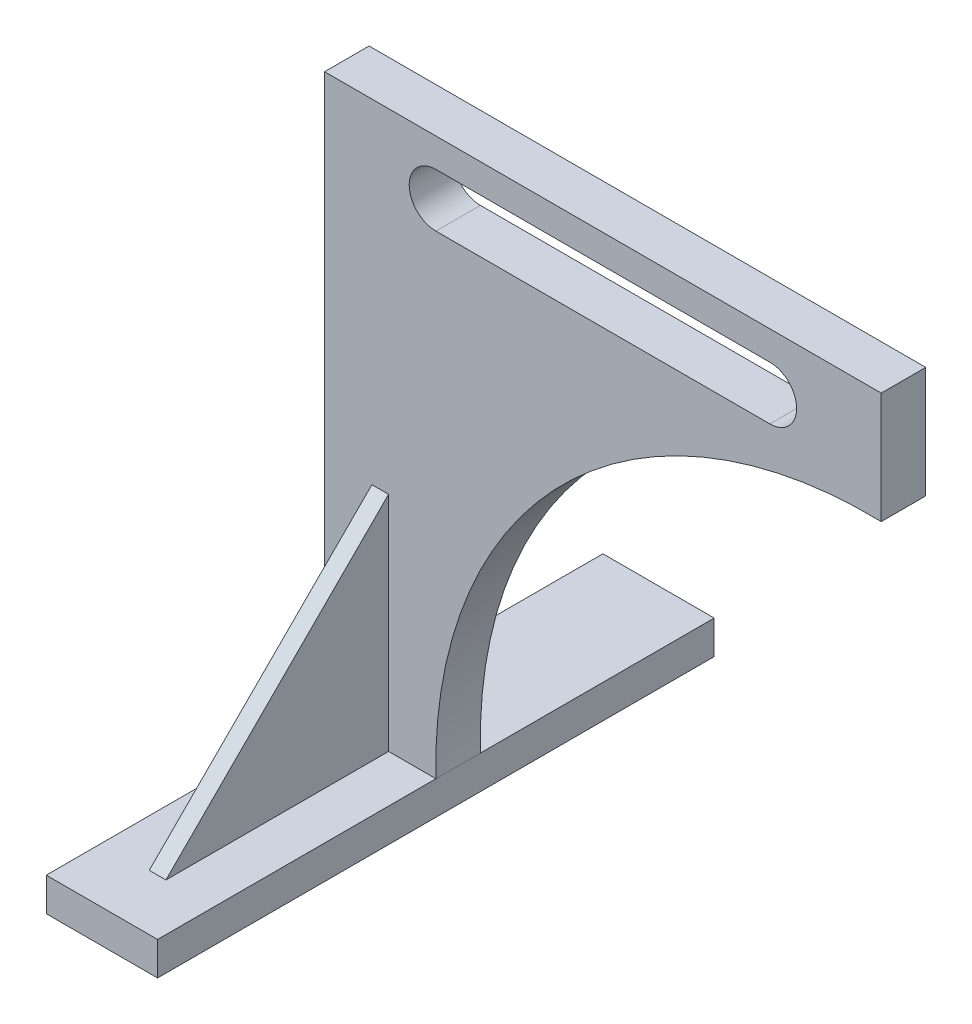
ISO-10303-21;
HEADER;
FILE_DESCRIPTION(('STEP AP214'),'2;1');
FILE_NAME('part.step','',(''),(''),'','','');
FILE_SCHEMA(('AUTOMOTIVE_DESIGN { 1 0 10303 214 1 1 1 1 }'));
ENDSEC;
DATA;
#1=APPLICATION_CONTEXT('core data for automotive mechanical design processes');
#2=APPLICATION_PROTOCOL_DEFINITION('international standard','automotive_design',2000,#1);
#3=PRODUCT_CONTEXT('',#1,'mechanical');
#4=PRODUCT('Part','Part','',(#3));
#5=PRODUCT_RELATED_PRODUCT_CATEGORY('part','',(#4));
#6=PRODUCT_DEFINITION_FORMATION('','',#4);
#7=PRODUCT_DEFINITION_CONTEXT('part definition',#1,'design');
#8=PRODUCT_DEFINITION('design','',#6,#7);
#9=PRODUCT_DEFINITION_SHAPE('','',#8);
#10=(LENGTH_UNIT() NAMED_UNIT(*) SI_UNIT(.MILLI.,.METRE.));
#11=(NAMED_UNIT(*) PLANE_ANGLE_UNIT() SI_UNIT($,.RADIAN.));
#12=(NAMED_UNIT(*) SI_UNIT($,.STERADIAN.) SOLID_ANGLE_UNIT());
#13=UNCERTAINTY_MEASURE_WITH_UNIT(LENGTH_MEASURE(1.E-05),#10,'distance_accuracy_value','');
#14=(GEOMETRIC_REPRESENTATION_CONTEXT(3) GLOBAL_UNCERTAINTY_ASSIGNED_CONTEXT((#13)) GLOBAL_UNIT_ASSIGNED_CONTEXT((#10,
#11,#12)) REPRESENTATION_CONTEXT('',''));
#15=CARTESIAN_POINT('',(0.,0.,0.));
#16=DIRECTION('',(0.,0.,1.));
#17=DIRECTION('',(1.,0.,0.));
#18=AXIS2_PLACEMENT_3D('',#15,#16,#17);
#19=CARTESIAN_POINT('',(-25.,7.5,-250.));
#20=DIRECTION('',(0.,1.,0.));
#21=DIRECTION('',(0.,0.,1.));
#22=AXIS2_PLACEMENT_3D('',#19,#20,#21);
#23=PLANE('',#22);
#24=DIRECTION('',(0.,0.,1.));
#25=VECTOR('',#24,1.);
#26=CARTESIAN_POINT('',(-25.,7.5,-250.));
#27=LINE('',#26,#25);
#28=CARTESIAN_POINT('',(-25.,7.5,-250.));
#29=VERTEX_POINT('',#28);
#30=CARTESIAN_POINT('',(-25.,7.5,-145.));
#31=VERTEX_POINT('',#30);
#32=EDGE_CURVE('E323',#29,#31,#27,.T.);
#33=ORIENTED_EDGE('',*,*,#32,.T.);
#34=DIRECTION('',(1.,0.,0.));
#35=VECTOR('',#34,1.);
#36=CARTESIAN_POINT('',(25.,7.5,-145.));
#37=LINE('',#36,#35);
#38=CARTESIAN_POINT('',(25.,7.5,-145.));
#39=VERTEX_POINT('',#38);
#40=EDGE_CURVE('E237',#31,#39,#37,.T.);
#41=ORIENTED_EDGE('',*,*,#40,.T.);
#42=DIRECTION('',(0.,0.,1.));
#43=VECTOR('',#42,1.);
#44=CARTESIAN_POINT('',(25.,7.5,-250.));
#45=LINE('',#44,#43);
#46=CARTESIAN_POINT('',(25.,7.5,-250.));
#47=VERTEX_POINT('',#46);
#48=EDGE_CURVE('E49',#47,#39,#45,.T.);
#49=ORIENTED_EDGE('',*,*,#48,.F.);
#50=DIRECTION('',(-1.,0.,0.));
#51=VECTOR('',#50,1.);
#52=CARTESIAN_POINT('',(-25.,7.5,-250.));
#53=LINE('',#52,#51);
#54=EDGE_CURVE('E294',#47,#29,#53,.T.);
#55=ORIENTED_EDGE('',*,*,#54,.T.);
#56=EDGE_LOOP('',(#33,#41,#49,#55));
#57=FACE_BOUND('',#56,.T.);
#58=ADVANCED_FACE('F45',(#57),#23,.T.);
#59=CARTESIAN_POINT('',(25.,7.5,-250.));
#60=DIRECTION('',(1.,0.,0.));
#61=DIRECTION('',(0.,1.,0.));
#62=AXIS2_PLACEMENT_3D('',#59,#60,#61);
#63=PLANE('',#62);
#64=DIRECTION('',(0.,1.,0.));
#65=VECTOR('',#64,1.);
#66=CARTESIAN_POINT('',(25.,7.5,0.));
#67=LINE('',#66,#65);
#68=CARTESIAN_POINT('',(25.,-7.5,0.));
#69=VERTEX_POINT('',#68);
#70=CARTESIAN_POINT('',(25.,7.5,0.));
#71=VERTEX_POINT('',#70);
#72=EDGE_CURVE('E280',#69,#71,#67,.T.);
#73=ORIENTED_EDGE('',*,*,#72,.F.);
#74=DIRECTION('',(0.,0.,1.));
#75=VECTOR('',#74,1.);
#76=CARTESIAN_POINT('',(25.,-7.5,-250.));
#77=LINE('',#76,#75);
#78=CARTESIAN_POINT('',(25.,-7.5,-250.));
#79=VERTEX_POINT('',#78);
#80=EDGE_CURVE('E11',#79,#69,#77,.T.);
#81=ORIENTED_EDGE('',*,*,#80,.F.);
#82=DIRECTION('',(0.,1.,0.));
#83=VECTOR('',#82,1.);
#84=CARTESIAN_POINT('',(25.,7.5,-250.));
#85=LINE('',#84,#83);
#86=EDGE_CURVE('E290',#79,#47,#85,.T.);
#87=ORIENTED_EDGE('',*,*,#86,.T.);
#88=ORIENTED_EDGE('',*,*,#48,.T.);
#89=DIRECTION('',(0.,0.,1.));
#90=VECTOR('',#89,1.);
#91=CARTESIAN_POINT('',(25.,7.50000000000005,-145.));
#92=LINE('',#91,#90);
#93=CARTESIAN_POINT('',(25.,7.50000000000005,-125.));
#94=VERTEX_POINT('',#93);
#95=EDGE_CURVE('E257',#39,#94,#92,.T.);
#96=ORIENTED_EDGE('',*,*,#95,.T.);
#97=EDGE_CURVE('E307',#94,#71,#45,.T.);
#98=ORIENTED_EDGE('',*,*,#97,.T.);
#99=EDGE_LOOP('',(#73,#81,#87,#88,#96,#98));
#100=FACE_BOUND('',#99,.T.);
#101=ADVANCED_FACE('F47',(#100),#63,.T.);
#102=CARTESIAN_POINT('',(-25.,-7.5,-250.));
#103=DIRECTION('',(0.,-1.,0.));
#104=DIRECTION('',(0.,0.,-1.));
#105=AXIS2_PLACEMENT_3D('',#102,#103,#104);
#106=PLANE('',#105);
#107=DIRECTION('',(1.,0.,0.));
#108=VECTOR('',#107,1.);
#109=CARTESIAN_POINT('',(-25.,-7.5,0.));
#110=LINE('',#109,#108);
#111=CARTESIAN_POINT('',(-25.,-7.5,0.));
#112=VERTEX_POINT('',#111);
#113=EDGE_CURVE('E295',#112,#69,#110,.T.);
#114=ORIENTED_EDGE('',*,*,#113,.F.);
#115=DIRECTION('',(0.,0.,1.));
#116=VECTOR('',#115,1.);
#117=CARTESIAN_POINT('',(-25.,-7.5,-250.));
#118=LINE('',#117,#116);
#119=CARTESIAN_POINT('',(-25.,-7.5,-250.));
#120=VERTEX_POINT('',#119);
#121=EDGE_CURVE('E55',#120,#112,#118,.T.);
#122=ORIENTED_EDGE('',*,*,#121,.F.);
#123=DIRECTION('',(1.,0.,0.));
#124=VECTOR('',#123,1.);
#125=CARTESIAN_POINT('',(-25.,-7.5,-250.));
#126=LINE('',#125,#124);
#127=EDGE_CURVE('E303',#120,#79,#126,.T.);
#128=ORIENTED_EDGE('',*,*,#127,.T.);
#129=ORIENTED_EDGE('',*,*,#80,.T.);
#130=EDGE_LOOP('',(#114,#122,#128,#129));
#131=FACE_BOUND('',#130,.T.);
#132=ADVANCED_FACE('F348',(#131),#106,.T.);
#133=CARTESIAN_POINT('',(-25.,7.5,-250.));
#134=DIRECTION('',(-1.,0.,0.));
#135=DIRECTION('',(0.,-1.,0.));
#136=AXIS2_PLACEMENT_3D('',#133,#134,#135);
#137=PLANE('',#136);
#138=DIRECTION('',(0.,-1.,0.));
#139=VECTOR('',#138,1.);
#140=CARTESIAN_POINT('',(-25.,7.5,0.));
#141=LINE('',#140,#139);
#142=CARTESIAN_POINT('',(-25.,7.5,0.));
#143=VERTEX_POINT('',#142);
#144=EDGE_CURVE('E315',#143,#112,#141,.T.);
#145=ORIENTED_EDGE('',*,*,#144,.F.);
#146=CARTESIAN_POINT('',(-25.,7.5,-125.));
#147=VERTEX_POINT('',#146);
#148=EDGE_CURVE('E325',#147,#143,#27,.T.);
#149=ORIENTED_EDGE('',*,*,#148,.F.);
#150=DIRECTION('',(0.,-1.,0.));
#151=VECTOR('',#150,1.);
#152=CARTESIAN_POINT('',(-25.,7.5,-125.));
#153=LINE('',#152,#151);
#154=CARTESIAN_POINT('',(-25.,257.5,-125.));
#155=VERTEX_POINT('',#154);
#156=EDGE_CURVE('E241',#155,#147,#153,.T.);
#157=ORIENTED_EDGE('',*,*,#156,.F.);
#158=DIRECTION('',(0.,0.,1.));
#159=VECTOR('',#158,1.);
#160=CARTESIAN_POINT('',(-25.,257.5,-145.));
#161=LINE('',#160,#159);
#162=CARTESIAN_POINT('',(-25.,257.5,-145.));
#163=VERTEX_POINT('',#162);
#164=EDGE_CURVE('E277',#163,#155,#161,.T.);
#165=ORIENTED_EDGE('',*,*,#164,.F.);
#166=DIRECTION('',(0.,-1.,0.));
#167=VECTOR('',#166,1.);
#168=CARTESIAN_POINT('',(-25.,7.5,-145.));
#169=LINE('',#168,#167);
#170=EDGE_CURVE('E253',#163,#31,#169,.T.);
#171=ORIENTED_EDGE('',*,*,#170,.T.);
#172=ORIENTED_EDGE('',*,*,#32,.F.);
#173=DIRECTION('',(0.,-1.,0.));
#174=VECTOR('',#173,1.);
#175=CARTESIAN_POINT('',(-25.,7.5,-250.));
#176=LINE('',#175,#174);
#177=EDGE_CURVE('E299',#29,#120,#176,.T.);
#178=ORIENTED_EDGE('',*,*,#177,.T.);
#179=ORIENTED_EDGE('',*,*,#121,.T.);
#180=EDGE_LOOP('',(#145,#149,#157,#165,#171,#172,#178,#179));
#181=FACE_BOUND('',#180,.T.);
#182=ADVANCED_FACE('F362',(#181),#137,.T.);
#183=DIRECTION('',(0.,0.,-1.));
#184=VECTOR('',#183,1.);
#185=CARTESIAN_POINT('',(3.75,7.50000000000005,-125.));
#186=LINE('',#185,#184);
#187=CARTESIAN_POINT('',(3.75,7.50000000000001,-25.));
#188=VERTEX_POINT('',#187);
#189=CARTESIAN_POINT('',(3.75,7.50000000000005,-125.));
#190=VERTEX_POINT('',#189);
#191=EDGE_CURVE('E209',#188,#190,#186,.T.);
#192=ORIENTED_EDGE('',*,*,#191,.F.);
#193=DIRECTION('',(-1.,0.,0.));
#194=VECTOR('',#193,1.);
#195=CARTESIAN_POINT('',(3.75,7.50000000000001,-25.));
#196=LINE('',#195,#194);
#197=CARTESIAN_POINT('',(-3.75,7.50000000000001,-25.));
#198=VERTEX_POINT('',#197);
#199=EDGE_CURVE('E219',#188,#198,#196,.T.);
#200=ORIENTED_EDGE('',*,*,#199,.T.);
#201=DIRECTION('',(0.,0.,-1.));
#202=VECTOR('',#201,1.);
#203=CARTESIAN_POINT('',(-3.75,7.50000000000005,-125.));
#204=LINE('',#203,#202);
#205=CARTESIAN_POINT('',(-3.75,7.50000000000005,-125.));
#206=VERTEX_POINT('',#205);
#207=EDGE_CURVE('E208',#198,#206,#204,.T.);
#208=ORIENTED_EDGE('',*,*,#207,.T.);
#209=DIRECTION('',(1.,0.,0.));
#210=VECTOR('',#209,1.);
#211=CARTESIAN_POINT('',(25.,7.5,-125.));
#212=LINE('',#211,#210);
#213=EDGE_CURVE('E258',#147,#206,#212,.T.);
#214=ORIENTED_EDGE('',*,*,#213,.F.);
#215=ORIENTED_EDGE('',*,*,#148,.T.);
#216=DIRECTION('',(-1.,0.,0.));
#217=VECTOR('',#216,1.);
#218=CARTESIAN_POINT('',(-25.,7.5,0.));
#219=LINE('',#218,#217);
#220=EDGE_CURVE('E311',#71,#143,#219,.T.);
#221=ORIENTED_EDGE('',*,*,#220,.F.);
#222=ORIENTED_EDGE('',*,*,#97,.F.);
#223=EDGE_CURVE('E236',#190,#94,#212,.T.);
#224=ORIENTED_EDGE('',*,*,#223,.F.);
#225=EDGE_LOOP('',(#192,#200,#208,#214,#215,#221,#222,#224));
#226=FACE_BOUND('',#225,.T.);
#227=ADVANCED_FACE('F343',(#226),#23,.T.);
#228=CARTESIAN_POINT('',(0.,0.,-250.));
#229=DIRECTION('',(0.,0.,1.));
#230=DIRECTION('',(1.,0.,0.));
#231=AXIS2_PLACEMENT_3D('',#228,#229,#230);
#232=PLANE('',#231);
#233=ORIENTED_EDGE('',*,*,#86,.F.);
#234=ORIENTED_EDGE('',*,*,#127,.F.);
#235=ORIENTED_EDGE('',*,*,#177,.F.);
#236=ORIENTED_EDGE('',*,*,#54,.F.);
#237=EDGE_LOOP('',(#233,#234,#235,#236));
#238=FACE_BOUND('',#237,.T.);
#239=ADVANCED_FACE('F353',(#238),#232,.F.);
#240=CARTESIAN_POINT('',(0.,0.,0.));
#241=DIRECTION('',(0.,0.,1.));
#242=DIRECTION('',(1.,0.,0.));
#243=AXIS2_PLACEMENT_3D('',#240,#241,#242);
#244=PLANE('',#243);
#245=ORIENTED_EDGE('',*,*,#72,.T.);
#246=ORIENTED_EDGE('',*,*,#220,.T.);
#247=ORIENTED_EDGE('',*,*,#144,.T.);
#248=ORIENTED_EDGE('',*,*,#113,.T.);
#249=EDGE_LOOP('',(#245,#246,#247,#248));
#250=FACE_BOUND('',#249,.T.);
#251=ADVANCED_FACE('F345',(#250),#244,.T.);
#252=CARTESIAN_POINT('',(-25.,257.5,-145.));
#253=DIRECTION('',(0.,1.,0.));
#254=DIRECTION('',(0.,0.,1.));
#255=AXIS2_PLACEMENT_3D('',#252,#253,#254);
#256=PLANE('',#255);
#257=DIRECTION('',(-1.,0.,0.));
#258=VECTOR('',#257,1.);
#259=CARTESIAN_POINT('',(-25.,257.5,-125.));
#260=LINE('',#259,#258);
#261=CARTESIAN_POINT('',(225.,257.5,-125.));
#262=VERTEX_POINT('',#261);
#263=EDGE_CURVE('E270',#262,#155,#260,.T.);
#264=ORIENTED_EDGE('',*,*,#263,.F.);
#265=DIRECTION('',(0.,0.,1.));
#266=VECTOR('',#265,1.);
#267=CARTESIAN_POINT('',(225.,257.5,-145.));
#268=LINE('',#267,#266);
#269=CARTESIAN_POINT('',(225.,257.5,-145.));
#270=VERTEX_POINT('',#269);
#271=EDGE_CURVE('E281',#270,#262,#268,.T.);
#272=ORIENTED_EDGE('',*,*,#271,.F.);
#273=DIRECTION('',(-1.,0.,0.));
#274=VECTOR('',#273,1.);
#275=CARTESIAN_POINT('',(-25.,257.5,-145.));
#276=LINE('',#275,#274);
#277=EDGE_CURVE('E249',#270,#163,#276,.T.);
#278=ORIENTED_EDGE('',*,*,#277,.T.);
#279=ORIENTED_EDGE('',*,*,#164,.T.);
#280=EDGE_LOOP('',(#264,#272,#278,#279));
#281=FACE_BOUND('',#280,.T.);
#282=ADVANCED_FACE('F366',(#281),#256,.T.);
#283=CARTESIAN_POINT('',(225.,257.5,-145.));
#284=DIRECTION('',(1.,0.,0.));
#285=DIRECTION('',(0.,0.,-1.));
#286=AXIS2_PLACEMENT_3D('',#283,#284,#285);
#287=PLANE('',#286);
#288=DIRECTION('',(0.,1.,0.));
#289=VECTOR('',#288,1.);
#290=CARTESIAN_POINT('',(225.,257.5,-125.));
#291=LINE('',#290,#289);
#292=CARTESIAN_POINT('',(225.,207.5,-125.));
#293=VERTEX_POINT('',#292);
#294=EDGE_CURVE('E266',#293,#262,#291,.T.);
#295=ORIENTED_EDGE('',*,*,#294,.F.);
#296=DIRECTION('',(0.,0.,1.));
#297=VECTOR('',#296,1.);
#298=CARTESIAN_POINT('',(225.,207.5,-145.));
#299=LINE('',#298,#297);
#300=CARTESIAN_POINT('',(225.,207.5,-145.));
#301=VERTEX_POINT('',#300);
#302=EDGE_CURVE('E284',#301,#293,#299,.T.);
#303=ORIENTED_EDGE('',*,*,#302,.F.);
#304=DIRECTION('',(0.,1.,0.));
#305=VECTOR('',#304,1.);
#306=CARTESIAN_POINT('',(225.,257.5,-145.));
#307=LINE('',#306,#305);
#308=EDGE_CURVE('E245',#301,#270,#307,.T.);
#309=ORIENTED_EDGE('',*,*,#308,.T.);
#310=ORIENTED_EDGE('',*,*,#271,.T.);
#311=EDGE_LOOP('',(#295,#303,#309,#310));
#312=FACE_BOUND('',#311,.T.);
#313=ADVANCED_FACE('F369',(#312),#287,.T.);
#314=CARTESIAN_POINT('',(219.934187730238,12.5658122697624,-145.));
#315=DIRECTION('',(0.,0.,1.));
#316=DIRECTION('',(1.,0.,0.));
#317=AXIS2_PLACEMENT_3D('',#314,#315,#316);
#318=CYLINDRICAL_SURFACE('',#317,195.);
#319=CARTESIAN_POINT('',(219.934187730238,12.5658122697624,-125.));
#320=DIRECTION('',(0.,0.,-1.));
#321=DIRECTION('',(1.,0.,0.));
#322=AXIS2_PLACEMENT_3D('',#319,#320,#321);
#323=CIRCLE('',#322,195.);
#324=EDGE_CURVE('E262',#94,#293,#323,.T.);
#325=ORIENTED_EDGE('',*,*,#324,.F.);
#326=ORIENTED_EDGE('',*,*,#95,.F.);
#327=CARTESIAN_POINT('',(219.934187730238,12.5658122697624,-145.));
#328=DIRECTION('',(0.,0.,-1.));
#329=DIRECTION('',(1.,0.,0.));
#330=AXIS2_PLACEMENT_3D('',#327,#328,#329);
#331=CIRCLE('',#330,195.);
#332=EDGE_CURVE('E240',#39,#301,#331,.T.);
#333=ORIENTED_EDGE('',*,*,#332,.T.);
#334=ORIENTED_EDGE('',*,*,#302,.T.);
#335=EDGE_LOOP('',(#325,#326,#333,#334));
#336=FACE_BOUND('',#335,.T.);
#337=ADVANCED_FACE('F371',(#336),#318,.F.);
#338=CARTESIAN_POINT('',(219.934187730238,12.5658122697624,-145.));
#339=DIRECTION('',(0.,0.,1.));
#340=DIRECTION('',(1.,0.,0.));
#341=AXIS2_PLACEMENT_3D('',#338,#339,#340);
#342=PLANE('',#341);
#343=DIRECTION('',(-1.,0.,0.));
#344=VECTOR('',#343,1.);
#345=CARTESIAN_POINT('',(219.934187730238,244.5,-145.));
#346=LINE('',#345,#344);
#347=CARTESIAN_POINT('',(175.,244.5,-145.));
#348=VERTEX_POINT('',#347);
#349=CARTESIAN_POINT('',(25.,244.5,-145.));
#350=VERTEX_POINT('',#349);
#351=EDGE_CURVE('E200',#348,#350,#346,.T.);
#352=ORIENTED_EDGE('',*,*,#351,.T.);
#353=CARTESIAN_POINT('',(25.,232.5,-145.));
#354=DIRECTION('',(0.,0.,1.));
#355=DIRECTION('',(1.,0.,0.));
#356=AXIS2_PLACEMENT_3D('',#353,#354,#355);
#357=CIRCLE('',#356,12.);
#358=CARTESIAN_POINT('',(25.,220.5,-145.));
#359=VERTEX_POINT('',#358);
#360=EDGE_CURVE('E204',#350,#359,#357,.T.);
#361=ORIENTED_EDGE('',*,*,#360,.T.);
#362=DIRECTION('',(1.,0.,0.));
#363=VECTOR('',#362,1.);
#364=CARTESIAN_POINT('',(219.934187730238,220.5,-145.));
#365=LINE('',#364,#363);
#366=CARTESIAN_POINT('',(175.,220.5,-145.));
#367=VERTEX_POINT('',#366);
#368=EDGE_CURVE('E191',#359,#367,#365,.T.);
#369=ORIENTED_EDGE('',*,*,#368,.T.);
#370=CARTESIAN_POINT('',(175.,232.5,-145.));
#371=DIRECTION('',(0.,0.,1.));
#372=DIRECTION('',(1.,0.,0.));
#373=AXIS2_PLACEMENT_3D('',#370,#371,#372);
#374=CIRCLE('',#373,12.);
#375=EDGE_CURVE('E166',#367,#348,#374,.T.);
#376=ORIENTED_EDGE('',*,*,#375,.T.);
#377=EDGE_LOOP('',(#352,#361,#369,#376));
#378=FACE_BOUND('',#377,.T.);
#379=ORIENTED_EDGE('',*,*,#40,.F.);
#380=ORIENTED_EDGE('',*,*,#170,.F.);
#381=ORIENTED_EDGE('',*,*,#277,.F.);
#382=ORIENTED_EDGE('',*,*,#308,.F.);
#383=ORIENTED_EDGE('',*,*,#332,.F.);
#384=EDGE_LOOP('',(#379,#380,#381,#382,#383));
#385=FACE_BOUND('',#384,.T.);
#386=ADVANCED_FACE('F358',(#378,#385),#342,.F.);
#387=CARTESIAN_POINT('',(219.934187730238,12.5658122697624,-125.));
#388=DIRECTION('',(0.,0.,1.));
#389=DIRECTION('',(1.,0.,0.));
#390=AXIS2_PLACEMENT_3D('',#387,#388,#389);
#391=PLANE('',#390);
#392=CARTESIAN_POINT('',(25.,232.5,-125.));
#393=DIRECTION('',(0.,0.,1.));
#394=DIRECTION('',(1.,0.,0.));
#395=AXIS2_PLACEMENT_3D('',#392,#393,#394);
#396=CIRCLE('',#395,12.);
#397=CARTESIAN_POINT('',(25.,244.5,-125.));
#398=VERTEX_POINT('',#397);
#399=CARTESIAN_POINT('',(25.,220.5,-125.));
#400=VERTEX_POINT('',#399);
#401=EDGE_CURVE('E71',#398,#400,#396,.T.);
#402=ORIENTED_EDGE('',*,*,#401,.F.);
#403=DIRECTION('',(-1.,0.,0.));
#404=VECTOR('',#403,1.);
#405=CARTESIAN_POINT('',(25.,244.5,-125.));
#406=LINE('',#405,#404);
#407=CARTESIAN_POINT('',(175.,244.5,-125.));
#408=VERTEX_POINT('',#407);
#409=EDGE_CURVE('E181',#408,#398,#406,.T.);
#410=ORIENTED_EDGE('',*,*,#409,.F.);
#411=CARTESIAN_POINT('',(175.,232.5,-125.));
#412=DIRECTION('',(0.,0.,1.));
#413=DIRECTION('',(1.,0.,0.));
#414=AXIS2_PLACEMENT_3D('',#411,#412,#413);
#415=CIRCLE('',#414,12.);
#416=CARTESIAN_POINT('',(175.,220.5,-125.));
#417=VERTEX_POINT('',#416);
#418=EDGE_CURVE('E163',#417,#408,#415,.T.);
#419=ORIENTED_EDGE('',*,*,#418,.F.);
#420=DIRECTION('',(1.,0.,0.));
#421=VECTOR('',#420,1.);
#422=CARTESIAN_POINT('',(25.,220.5,-125.));
#423=LINE('',#422,#421);
#424=EDGE_CURVE('E173',#400,#417,#423,.T.);
#425=ORIENTED_EDGE('',*,*,#424,.F.);
#426=EDGE_LOOP('',(#402,#410,#419,#425));
#427=FACE_BOUND('',#426,.T.);
#428=DIRECTION('',(0.,1.,0.));
#429=VECTOR('',#428,1.);
#430=CARTESIAN_POINT('',(3.75,107.5,-125.));
#431=LINE('',#430,#429);
#432=CARTESIAN_POINT('',(3.75,107.5,-125.));
#433=VERTEX_POINT('',#432);
#434=EDGE_CURVE('E212',#190,#433,#431,.T.);
#435=ORIENTED_EDGE('',*,*,#434,.F.);
#436=ORIENTED_EDGE('',*,*,#223,.T.);
#437=ORIENTED_EDGE('',*,*,#324,.T.);
#438=ORIENTED_EDGE('',*,*,#294,.T.);
#439=ORIENTED_EDGE('',*,*,#263,.T.);
#440=ORIENTED_EDGE('',*,*,#156,.T.);
#441=ORIENTED_EDGE('',*,*,#213,.T.);
#442=DIRECTION('',(0.,1.,0.));
#443=VECTOR('',#442,1.);
#444=CARTESIAN_POINT('',(-3.75,107.5,-125.));
#445=LINE('',#444,#443);
#446=CARTESIAN_POINT('',(-3.75,107.5,-125.));
#447=VERTEX_POINT('',#446);
#448=EDGE_CURVE('E223',#206,#447,#445,.T.);
#449=ORIENTED_EDGE('',*,*,#448,.T.);
#450=DIRECTION('',(-1.,0.,0.));
#451=VECTOR('',#450,1.);
#452=CARTESIAN_POINT('',(3.75,107.5,-125.));
#453=LINE('',#452,#451);
#454=EDGE_CURVE('E232',#433,#447,#453,.T.);
#455=ORIENTED_EDGE('',*,*,#454,.F.);
#456=EDGE_LOOP('',(#435,#436,#437,#438,#439,#440,#441,#449,#455));
#457=FACE_BOUND('',#456,.T.);
#458=ADVANCED_FACE('F178',(#427,#457),#391,.T.);
#459=CARTESIAN_POINT('',(3.75,7.50000000000001,-25.));
#460=DIRECTION('',(0.,-0.707106781186547,-0.707106781186547));
#461=DIRECTION('',(0.,0.707106781186548,-0.707106781186547));
#462=AXIS2_PLACEMENT_3D('',#459,#460,#461);
#463=PLANE('',#462);
#464=DIRECTION('',(0.,-0.707106781186547,0.707106781186547));
#465=VECTOR('',#464,1.);
#466=CARTESIAN_POINT('',(-3.75,7.50000000000001,-25.));
#467=LINE('',#466,#465);
#468=EDGE_CURVE('E213',#447,#198,#467,.T.);
#469=ORIENTED_EDGE('',*,*,#468,.T.);
#470=ORIENTED_EDGE('',*,*,#199,.F.);
#471=DIRECTION('',(0.,-0.707106781186547,0.707106781186547));
#472=VECTOR('',#471,1.);
#473=CARTESIAN_POINT('',(3.75,7.50000000000001,-25.));
#474=LINE('',#473,#472);
#475=EDGE_CURVE('E216',#433,#188,#474,.T.);
#476=ORIENTED_EDGE('',*,*,#475,.F.);
#477=ORIENTED_EDGE('',*,*,#454,.T.);
#478=EDGE_LOOP('',(#469,#470,#476,#477));
#479=FACE_BOUND('',#478,.T.);
#480=ADVANCED_FACE('F380',(#479),#463,.F.);
#481=CARTESIAN_POINT('',(3.75,0.,0.));
#482=DIRECTION('',(1.,0.,0.));
#483=DIRECTION('',(0.,0.,-1.));
#484=AXIS2_PLACEMENT_3D('',#481,#482,#483);
#485=PLANE('',#484);
#486=ORIENTED_EDGE('',*,*,#191,.T.);
#487=ORIENTED_EDGE('',*,*,#434,.T.);
#488=ORIENTED_EDGE('',*,*,#475,.T.);
#489=EDGE_LOOP('',(#486,#487,#488));
#490=FACE_BOUND('',#489,.T.);
#491=ADVANCED_FACE('F377',(#490),#485,.T.);
#492=CARTESIAN_POINT('',(-3.75,0.,0.));
#493=DIRECTION('',(1.,0.,0.));
#494=DIRECTION('',(0.,0.,-1.));
#495=AXIS2_PLACEMENT_3D('',#492,#493,#494);
#496=PLANE('',#495);
#497=ORIENTED_EDGE('',*,*,#207,.F.);
#498=ORIENTED_EDGE('',*,*,#468,.F.);
#499=ORIENTED_EDGE('',*,*,#448,.F.);
#500=EDGE_LOOP('',(#497,#498,#499));
#501=FACE_BOUND('',#500,.T.);
#502=ADVANCED_FACE('F383',(#501),#496,.F.);
#503=CARTESIAN_POINT('',(25.,232.5,-250.));
#504=DIRECTION('',(0.,0.,1.));
#505=DIRECTION('',(1.,0.,0.));
#506=AXIS2_PLACEMENT_3D('',#503,#504,#505);
#507=CYLINDRICAL_SURFACE('',#506,12.);
#508=DIRECTION('',(0.,0.,1.));
#509=VECTOR('',#508,1.);
#510=CARTESIAN_POINT('',(25.,244.5,-250.));
#511=LINE('',#510,#509);
#512=EDGE_CURVE('E188',#350,#398,#511,.T.);
#513=ORIENTED_EDGE('',*,*,#512,.T.);
#514=ORIENTED_EDGE('',*,*,#401,.T.);
#515=DIRECTION('',(0.,0.,1.));
#516=VECTOR('',#515,1.);
#517=CARTESIAN_POINT('',(25.,220.5,-250.));
#518=LINE('',#517,#516);
#519=EDGE_CURVE('E170',#359,#400,#518,.T.);
#520=ORIENTED_EDGE('',*,*,#519,.F.);
#521=ORIENTED_EDGE('',*,*,#360,.F.);
#522=EDGE_LOOP('',(#513,#514,#520,#521));
#523=FACE_BOUND('',#522,.T.);
#524=ADVANCED_FACE('F385',(#523),#507,.F.);
#525=CARTESIAN_POINT('',(25.,244.5,-250.));
#526=DIRECTION('',(0.,1.,0.));
#527=DIRECTION('',(0.,0.,1.));
#528=AXIS2_PLACEMENT_3D('',#525,#526,#527);
#529=PLANE('',#528);
#530=DIRECTION('',(0.,0.,1.));
#531=VECTOR('',#530,1.);
#532=CARTESIAN_POINT('',(175.,244.5,-250.));
#533=LINE('',#532,#531);
#534=EDGE_CURVE('E169',#348,#408,#533,.T.);
#535=ORIENTED_EDGE('',*,*,#534,.T.);
#536=ORIENTED_EDGE('',*,*,#409,.T.);
#537=ORIENTED_EDGE('',*,*,#512,.F.);
#538=ORIENTED_EDGE('',*,*,#351,.F.);
#539=EDGE_LOOP('',(#535,#536,#537,#538));
#540=FACE_BOUND('',#539,.T.);
#541=ADVANCED_FACE('F392',(#540),#529,.F.);
#542=CARTESIAN_POINT('',(175.,232.5,-250.));
#543=DIRECTION('',(0.,0.,1.));
#544=DIRECTION('',(1.,0.,0.));
#545=AXIS2_PLACEMENT_3D('',#542,#543,#544);
#546=CYLINDRICAL_SURFACE('',#545,12.);
#547=DIRECTION('',(0.,0.,1.));
#548=VECTOR('',#547,1.);
#549=CARTESIAN_POINT('',(175.,220.5,-250.));
#550=LINE('',#549,#548);
#551=EDGE_CURVE('E63',#367,#417,#550,.T.);
#552=ORIENTED_EDGE('',*,*,#551,.T.);
#553=ORIENTED_EDGE('',*,*,#418,.T.);
#554=ORIENTED_EDGE('',*,*,#534,.F.);
#555=ORIENTED_EDGE('',*,*,#375,.F.);
#556=EDGE_LOOP('',(#552,#553,#554,#555));
#557=FACE_BOUND('',#556,.T.);
#558=ADVANCED_FACE('F160',(#557),#546,.F.);
#559=CARTESIAN_POINT('',(25.,220.5,-250.));
#560=DIRECTION('',(0.,-1.,0.));
#561=DIRECTION('',(0.,0.,-1.));
#562=AXIS2_PLACEMENT_3D('',#559,#560,#561);
#563=PLANE('',#562);
#564=ORIENTED_EDGE('',*,*,#519,.T.);
#565=ORIENTED_EDGE('',*,*,#424,.T.);
#566=ORIENTED_EDGE('',*,*,#551,.F.);
#567=ORIENTED_EDGE('',*,*,#368,.F.);
#568=EDGE_LOOP('',(#564,#565,#566,#567));
#569=FACE_BOUND('',#568,.T.);
#570=ADVANCED_FACE('F174',(#569),#563,.F.);
#571=CLOSED_SHELL('',(#58,#101,#132,#182,#227,#239,#251,#282,#313,#337,#386,#458,#480,#491,#502,
#524,#541,#558,#570));
#572=MANIFOLD_SOLID_BREP('B2',#571);
#573=ADVANCED_BREP_SHAPE_REPRESENTATION('',(#18,#572),#14);
#574=SHAPE_DEFINITION_REPRESENTATION(#9,#573);
ENDSEC;
END-ISO-10303-21;
